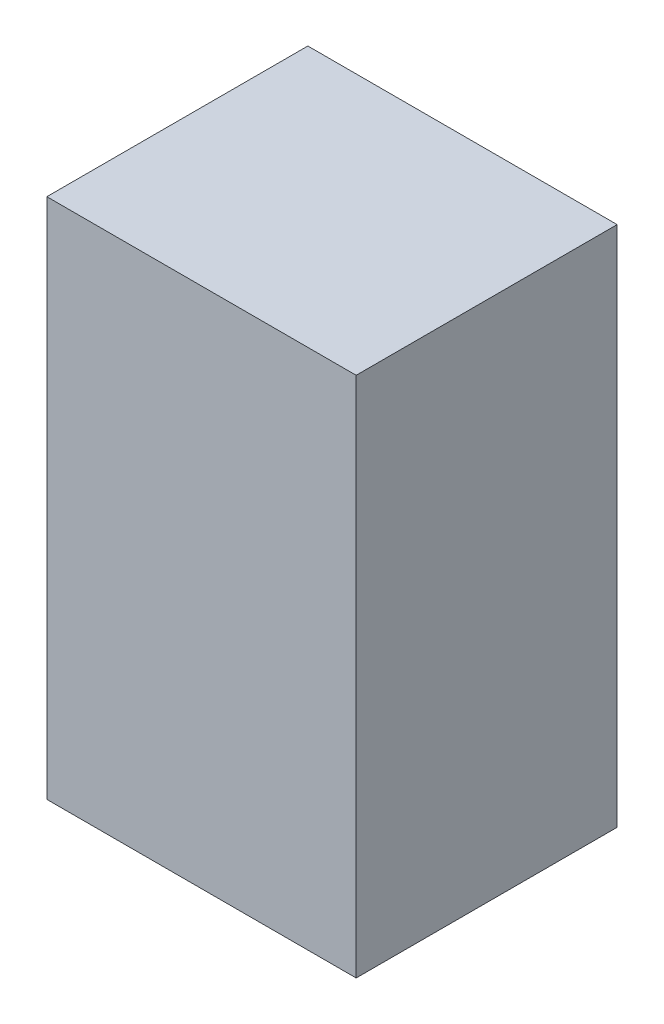
ISO-10303-21;
HEADER;
FILE_DESCRIPTION(('STEP AP214'),'2;1');
FILE_NAME('part.step','',(''),(''),'','','');
FILE_SCHEMA(('AUTOMOTIVE_DESIGN { 1 0 10303 214 1 1 1 1 }'));
ENDSEC;
DATA;
#1=APPLICATION_CONTEXT('core data for automotive mechanical design processes');
#2=APPLICATION_PROTOCOL_DEFINITION('international standard','automotive_design',2000,#1);
#3=PRODUCT_CONTEXT('',#1,'mechanical');
#4=PRODUCT('Part','Part','',(#3));
#5=PRODUCT_RELATED_PRODUCT_CATEGORY('part','',(#4));
#6=PRODUCT_DEFINITION_FORMATION('','',#4);
#7=PRODUCT_DEFINITION_CONTEXT('part definition',#1,'design');
#8=PRODUCT_DEFINITION('design','',#6,#7);
#9=PRODUCT_DEFINITION_SHAPE('','',#8);
#10=(LENGTH_UNIT() NAMED_UNIT(*) SI_UNIT(.MILLI.,.METRE.));
#11=(NAMED_UNIT(*) PLANE_ANGLE_UNIT() SI_UNIT($,.RADIAN.));
#12=(NAMED_UNIT(*) SI_UNIT($,.STERADIAN.) SOLID_ANGLE_UNIT());
#13=UNCERTAINTY_MEASURE_WITH_UNIT(LENGTH_MEASURE(1.E-05),#10,'distance_accuracy_value','');
#14=(GEOMETRIC_REPRESENTATION_CONTEXT(3) GLOBAL_UNCERTAINTY_ASSIGNED_CONTEXT((#13)) GLOBAL_UNIT_ASSIGNED_CONTEXT((#10,
#11,#12)) REPRESENTATION_CONTEXT('',''));
#15=CARTESIAN_POINT('',(0.,0.,0.));
#16=DIRECTION('',(0.,0.,1.));
#17=DIRECTION('',(1.,0.,0.));
#18=AXIS2_PLACEMENT_3D('',#15,#16,#17);
#19=CARTESIAN_POINT('',(-0.80000094,-1.34999984,1.34999984));
#20=DIRECTION('',(0.,0.,-1.));
#21=DIRECTION('',(-1.,0.,0.));
#22=AXIS2_PLACEMENT_3D('',#19,#20,#21);
#23=PLANE('',#22);
#24=DIRECTION('',(0.,1.,0.));
#25=VECTOR('',#24,1.);
#26=CARTESIAN_POINT('',(0.80000094,-1.34999984,1.34999984));
#27=LINE('',#26,#25);
#28=CARTESIAN_POINT('',(0.80000094,-1.34999984,1.34999984));
#29=VERTEX_POINT('',#28);
#30=CARTESIAN_POINT('',(0.80000094,1.34999984,1.34999984));
#31=VERTEX_POINT('',#30);
#32=EDGE_CURVE('E55',#29,#31,#27,.T.);
#33=ORIENTED_EDGE('',*,*,#32,.T.);
#34=DIRECTION('',(1.,0.,0.));
#35=VECTOR('',#34,1.);
#36=CARTESIAN_POINT('',(0.80000094,1.34999984,1.34999984));
#37=LINE('',#36,#35);
#38=CARTESIAN_POINT('',(-0.80000094,1.34999984,1.34999984));
#39=VERTEX_POINT('',#38);
#40=EDGE_CURVE('E58',#31,#39,#37,.F.);
#41=ORIENTED_EDGE('',*,*,#40,.T.);
#42=DIRECTION('',(0.,1.,0.));
#43=VECTOR('',#42,1.);
#44=CARTESIAN_POINT('',(-0.80000094,1.34999984,1.34999984));
#45=LINE('',#44,#43);
#46=CARTESIAN_POINT('',(-0.80000094,-1.34999984,1.34999984));
#47=VERTEX_POINT('',#46);
#48=EDGE_CURVE('E60',#39,#47,#45,.F.);
#49=ORIENTED_EDGE('',*,*,#48,.T.);
#50=DIRECTION('',(-1.,0.,0.));
#51=VECTOR('',#50,1.);
#52=CARTESIAN_POINT('',(-0.80000094,-1.34999984,1.34999984));
#53=LINE('',#52,#51);
#54=EDGE_CURVE('E20',#29,#47,#53,.T.);
#55=ORIENTED_EDGE('',*,*,#54,.F.);
#56=EDGE_LOOP('',(#33,#41,#49,#55));
#57=FACE_BOUND('',#56,.T.);
#58=ADVANCED_FACE('F17',(#57),#23,.F.);
#59=CARTESIAN_POINT('',(-0.80000094,1.34999984,0.));
#60=DIRECTION('',(1.,0.,0.));
#61=DIRECTION('',(0.,0.,-1.));
#62=AXIS2_PLACEMENT_3D('',#59,#60,#61);
#63=PLANE('',#62);
#64=DIRECTION('',(0.,0.,1.));
#65=VECTOR('',#64,1.);
#66=CARTESIAN_POINT('',(-0.80000094,-1.34999984,0.));
#67=LINE('',#66,#65);
#68=CARTESIAN_POINT('',(-0.80000094,-1.34999984,0.));
#69=VERTEX_POINT('',#68);
#70=EDGE_CURVE('E71',#69,#47,#67,.T.);
#71=ORIENTED_EDGE('',*,*,#70,.T.);
#72=ORIENTED_EDGE('',*,*,#48,.F.);
#73=DIRECTION('',(0.,0.,-1.));
#74=VECTOR('',#73,1.);
#75=CARTESIAN_POINT('',(-0.80000094,1.34999984,0.));
#76=LINE('',#75,#74);
#77=CARTESIAN_POINT('',(-0.80000094,1.34999984,0.));
#78=VERTEX_POINT('',#77);
#79=EDGE_CURVE('E65',#39,#78,#76,.T.);
#80=ORIENTED_EDGE('',*,*,#79,.T.);
#81=DIRECTION('',(0.,1.,0.));
#82=VECTOR('',#81,1.);
#83=CARTESIAN_POINT('',(-0.80000094,-1.34999984,0.));
#84=LINE('',#83,#82);
#85=EDGE_CURVE('E83',#69,#78,#84,.T.);
#86=ORIENTED_EDGE('',*,*,#85,.F.);
#87=EDGE_LOOP('',(#71,#72,#80,#86));
#88=FACE_BOUND('',#87,.T.);
#89=ADVANCED_FACE('F68',(#88),#63,.F.);
#90=CARTESIAN_POINT('',(0.80000094,1.34999984,0.));
#91=DIRECTION('',(0.,-1.,0.));
#92=DIRECTION('',(0.,0.,-1.));
#93=AXIS2_PLACEMENT_3D('',#90,#91,#92);
#94=PLANE('',#93);
#95=ORIENTED_EDGE('',*,*,#79,.F.);
#96=ORIENTED_EDGE('',*,*,#40,.F.);
#97=DIRECTION('',(0.,0.,1.));
#98=VECTOR('',#97,1.);
#99=CARTESIAN_POINT('',(0.80000094,1.34999984,0.));
#100=LINE('',#99,#98);
#101=CARTESIAN_POINT('',(0.80000094,1.34999984,0.));
#102=VERTEX_POINT('',#101);
#103=EDGE_CURVE('E77',#31,#102,#100,.F.);
#104=ORIENTED_EDGE('',*,*,#103,.T.);
#105=DIRECTION('',(-1.,0.,0.));
#106=VECTOR('',#105,1.);
#107=CARTESIAN_POINT('',(-0.80000094,1.34999984,0.));
#108=LINE('',#107,#106);
#109=EDGE_CURVE('E74',#78,#102,#108,.F.);
#110=ORIENTED_EDGE('',*,*,#109,.F.);
#111=EDGE_LOOP('',(#95,#96,#104,#110));
#112=FACE_BOUND('',#111,.T.);
#113=ADVANCED_FACE('F72',(#112),#94,.F.);
#114=CARTESIAN_POINT('',(0.80000094,-1.34999984,0.));
#115=DIRECTION('',(-1.,0.,0.));
#116=DIRECTION('',(0.,0.,1.));
#117=AXIS2_PLACEMENT_3D('',#114,#115,#116);
#118=PLANE('',#117);
#119=ORIENTED_EDGE('',*,*,#103,.F.);
#120=ORIENTED_EDGE('',*,*,#32,.F.);
#121=DIRECTION('',(0.,0.,1.));
#122=VECTOR('',#121,1.);
#123=CARTESIAN_POINT('',(0.80000094,-1.34999984,0.));
#124=LINE('',#123,#122);
#125=CARTESIAN_POINT('',(0.80000094,-1.34999984,0.));
#126=VERTEX_POINT('',#125);
#127=EDGE_CURVE('E35',#29,#126,#124,.F.);
#128=ORIENTED_EDGE('',*,*,#127,.T.);
#129=DIRECTION('',(0.,1.,0.));
#130=VECTOR('',#129,1.);
#131=CARTESIAN_POINT('',(0.80000094,-1.34999984,0.));
#132=LINE('',#131,#130);
#133=EDGE_CURVE('E26',#102,#126,#132,.F.);
#134=ORIENTED_EDGE('',*,*,#133,.F.);
#135=EDGE_LOOP('',(#119,#120,#128,#134));
#136=FACE_BOUND('',#135,.T.);
#137=ADVANCED_FACE('F89',(#136),#118,.F.);
#138=CARTESIAN_POINT('',(-0.80000094,-1.34999984,0.));
#139=DIRECTION('',(0.,1.,0.));
#140=DIRECTION('',(0.,0.,1.));
#141=AXIS2_PLACEMENT_3D('',#138,#139,#140);
#142=PLANE('',#141);
#143=ORIENTED_EDGE('',*,*,#127,.F.);
#144=ORIENTED_EDGE('',*,*,#54,.T.);
#145=ORIENTED_EDGE('',*,*,#70,.F.);
#146=DIRECTION('',(-1.,0.,0.));
#147=VECTOR('',#146,1.);
#148=CARTESIAN_POINT('',(-0.80000094,-1.34999984,0.));
#149=LINE('',#148,#147);
#150=EDGE_CURVE('E11',#126,#69,#149,.T.);
#151=ORIENTED_EDGE('',*,*,#150,.F.);
#152=EDGE_LOOP('',(#143,#144,#145,#151));
#153=FACE_BOUND('',#152,.T.);
#154=ADVANCED_FACE('F91',(#153),#142,.F.);
#155=CARTESIAN_POINT('',(-0.80000094,-1.34999984,0.));
#156=DIRECTION('',(0.,0.,-1.));
#157=DIRECTION('',(-1.,0.,0.));
#158=AXIS2_PLACEMENT_3D('',#155,#156,#157);
#159=PLANE('',#158);
#160=ORIENTED_EDGE('',*,*,#133,.T.);
#161=ORIENTED_EDGE('',*,*,#150,.T.);
#162=ORIENTED_EDGE('',*,*,#85,.T.);
#163=ORIENTED_EDGE('',*,*,#109,.T.);
#164=EDGE_LOOP('',(#160,#161,#162,#163));
#165=FACE_BOUND('',#164,.T.);
#166=ADVANCED_FACE('F88',(#165),#159,.T.);
#167=CLOSED_SHELL('',(#58,#89,#113,#137,#154,#166));
#168=MANIFOLD_SOLID_BREP('B1',#167);
#169=ADVANCED_BREP_SHAPE_REPRESENTATION('',(#18,#168),#14);
#170=SHAPE_DEFINITION_REPRESENTATION(#9,#169);
ENDSEC;
END-ISO-10303-21;
